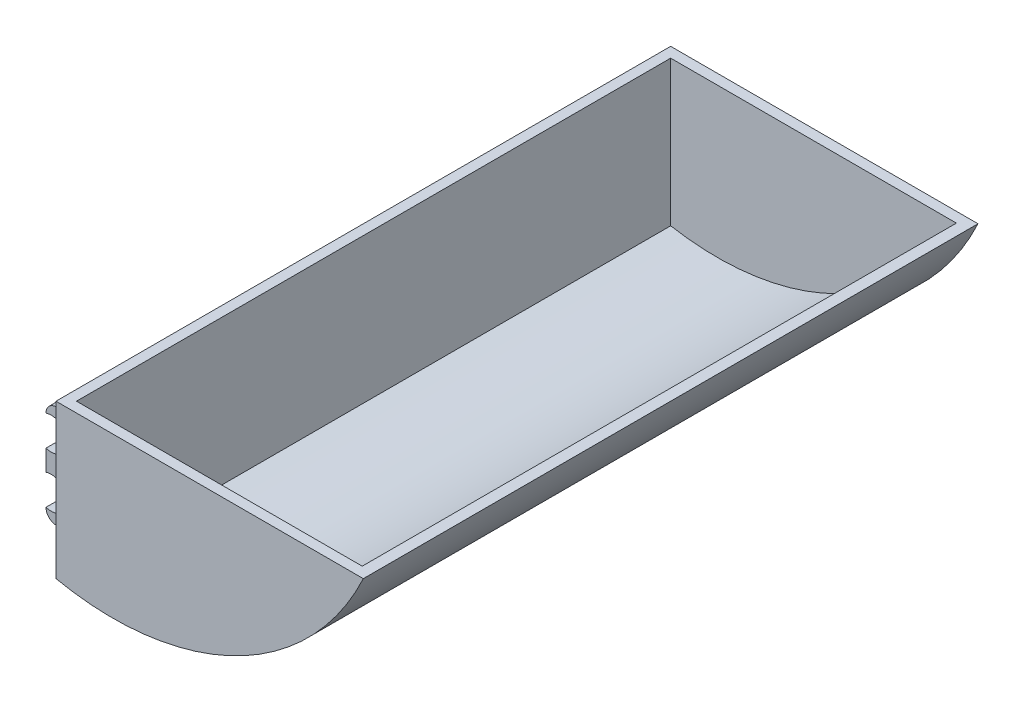
ISO-10303-21;
HEADER;
FILE_DESCRIPTION(('STEP AP214'),'2;1');
FILE_NAME('part.step','',(''),(''),'','','');
FILE_SCHEMA(('AUTOMOTIVE_DESIGN { 1 0 10303 214 1 1 1 1 }'));
ENDSEC;
DATA;
#1=APPLICATION_CONTEXT('core data for automotive mechanical design processes');
#2=APPLICATION_PROTOCOL_DEFINITION('international standard','automotive_design',2000,#1);
#3=PRODUCT_CONTEXT('',#1,'mechanical');
#4=PRODUCT('Part','Part','',(#3));
#5=PRODUCT_RELATED_PRODUCT_CATEGORY('part','',(#4));
#6=PRODUCT_DEFINITION_FORMATION('','',#4);
#7=PRODUCT_DEFINITION_CONTEXT('part definition',#1,'design');
#8=PRODUCT_DEFINITION('design','',#6,#7);
#9=PRODUCT_DEFINITION_SHAPE('','',#8);
#10=(LENGTH_UNIT() NAMED_UNIT(*) SI_UNIT(.MILLI.,.METRE.));
#11=(NAMED_UNIT(*) PLANE_ANGLE_UNIT() SI_UNIT($,.RADIAN.));
#12=(NAMED_UNIT(*) SI_UNIT($,.STERADIAN.) SOLID_ANGLE_UNIT());
#13=UNCERTAINTY_MEASURE_WITH_UNIT(LENGTH_MEASURE(1.E-05),#10,'distance_accuracy_value','');
#14=(GEOMETRIC_REPRESENTATION_CONTEXT(3) GLOBAL_UNCERTAINTY_ASSIGNED_CONTEXT((#13)) GLOBAL_UNIT_ASSIGNED_CONTEXT((#10,
#11,#12)) REPRESENTATION_CONTEXT('',''));
#15=CARTESIAN_POINT('',(0.,0.,0.));
#16=DIRECTION('',(0.,0.,1.));
#17=DIRECTION('',(1.,0.,0.));
#18=AXIS2_PLACEMENT_3D('',#15,#16,#17);
#19=CARTESIAN_POINT('',(-7.62,0.,152.4));
#20=DIRECTION('',(-1.,0.,0.));
#21=DIRECTION('',(0.,0.,-1.));
#22=AXIS2_PLACEMENT_3D('',#19,#20,#21);
#23=PLANE('',#22);
#24=DIRECTION('',(0.,1.,0.));
#25=VECTOR('',#24,1.);
#26=CARTESIAN_POINT('',(-7.62,31.75,147.2565));
#27=LINE('',#26,#25);
#28=CARTESIAN_POINT('',(-7.62,16.4533603290918,147.2565));
#29=VERTEX_POINT('',#28);
#30=CARTESIAN_POINT('',(-7.62,21.6466396709082,147.2565));
#31=VERTEX_POINT('',#30);
#32=EDGE_CURVE('E249',#29,#31,#27,.T.);
#33=ORIENTED_EDGE('',*,*,#32,.T.);
#34=DIRECTION('',(0.,0.,1.));
#35=VECTOR('',#34,1.);
#36=CARTESIAN_POINT('',(-7.62,21.6466396709082,134.5565));
#37=LINE('',#36,#35);
#38=CARTESIAN_POINT('',(-7.62,21.6466396709082,139.319));
#39=VERTEX_POINT('',#38);
#40=EDGE_CURVE('E481',#31,#39,#37,.F.);
#41=ORIENTED_EDGE('',*,*,#40,.T.);
#42=DIRECTION('',(0.,-1.,0.));
#43=VECTOR('',#42,1.);
#44=CARTESIAN_POINT('',(-7.62,31.75,139.319));
#45=LINE('',#44,#43);
#46=CARTESIAN_POINT('',(-7.62,16.4533603290918,139.319));
#47=VERTEX_POINT('',#46);
#48=EDGE_CURVE('E281',#39,#47,#45,.T.);
#49=ORIENTED_EDGE('',*,*,#48,.T.);
#50=DIRECTION('',(0.,0.,1.));
#51=VECTOR('',#50,1.);
#52=CARTESIAN_POINT('',(-7.62,16.4533603290918,134.5565));
#53=LINE('',#52,#51);
#54=EDGE_CURVE('E260',#47,#29,#53,.T.);
#55=ORIENTED_EDGE('',*,*,#54,.T.);
#56=EDGE_LOOP('',(#33,#41,#49,#55));
#57=FACE_BOUND('',#56,.T.);
#58=ADVANCED_FACE('F39',(#57),#23,.T.);
#59=CARTESIAN_POINT('',(-7.62,29.1533603290918,147.2565));
#60=VERTEX_POINT('',#59);
#61=CARTESIAN_POINT('',(-7.62,29.21,147.2565));
#62=VERTEX_POINT('',#61);
#63=EDGE_CURVE('E251',#60,#62,#27,.T.);
#64=ORIENTED_EDGE('',*,*,#63,.T.);
#65=DIRECTION('',(0.,0.,-1.));
#66=VECTOR('',#65,1.);
#67=CARTESIAN_POINT('',(-7.62,29.21,139.319));
#68=LINE('',#67,#66);
#69=CARTESIAN_POINT('',(-7.62,29.21,139.319));
#70=VERTEX_POINT('',#69);
#71=EDGE_CURVE('E512',#62,#70,#68,.T.);
#72=ORIENTED_EDGE('',*,*,#71,.T.);
#73=CARTESIAN_POINT('',(-7.62,29.1533603290918,139.319));
#74=VERTEX_POINT('',#73);
#75=EDGE_CURVE('E277',#70,#74,#45,.T.);
#76=ORIENTED_EDGE('',*,*,#75,.T.);
#77=DIRECTION('',(0.,0.,1.));
#78=VECTOR('',#77,1.);
#79=CARTESIAN_POINT('',(-7.62,29.1533603290918,134.5565));
#80=LINE('',#79,#78);
#81=EDGE_CURVE('E259',#74,#60,#80,.T.);
#82=ORIENTED_EDGE('',*,*,#81,.T.);
#83=EDGE_LOOP('',(#64,#72,#76,#82));
#84=FACE_BOUND('',#83,.T.);
#85=ADVANCED_FACE('F562',(#84),#23,.T.);
#86=CARTESIAN_POINT('',(-7.62,8.94663967090822,139.319));
#87=VERTEX_POINT('',#86);
#88=CARTESIAN_POINT('',(-7.62,8.89,139.319));
#89=VERTEX_POINT('',#88);
#90=EDGE_CURVE('E248',#87,#89,#45,.T.);
#91=ORIENTED_EDGE('',*,*,#90,.T.);
#92=DIRECTION('',(0.,0.,1.));
#93=VECTOR('',#92,1.);
#94=CARTESIAN_POINT('',(-7.62,8.89,147.2565));
#95=LINE('',#94,#93);
#96=CARTESIAN_POINT('',(-7.62,8.89,147.2565));
#97=VERTEX_POINT('',#96);
#98=EDGE_CURVE('E244',#89,#97,#95,.T.);
#99=ORIENTED_EDGE('',*,*,#98,.T.);
#100=CARTESIAN_POINT('',(-7.62,8.94663967090822,147.2565));
#101=VERTEX_POINT('',#100);
#102=EDGE_CURVE('E237',#97,#101,#27,.T.);
#103=ORIENTED_EDGE('',*,*,#102,.T.);
#104=DIRECTION('',(0.,0.,1.));
#105=VECTOR('',#104,1.);
#106=CARTESIAN_POINT('',(-7.62,8.94663967090822,134.5565));
#107=LINE('',#106,#105);
#108=EDGE_CURVE('E241',#101,#87,#107,.F.);
#109=ORIENTED_EDGE('',*,*,#108,.T.);
#110=EDGE_LOOP('',(#91,#99,#103,#109));
#111=FACE_BOUND('',#110,.T.);
#112=ADVANCED_FACE('F240',(#111),#23,.T.);
#113=CARTESIAN_POINT('',(0.,0.,152.4));
#114=DIRECTION('',(1.,0.,0.));
#115=DIRECTION('',(0.,0.,-1.));
#116=AXIS2_PLACEMENT_3D('',#113,#114,#115);
#117=PLANE('',#116);
#118=DIRECTION('',(0.,-1.,0.));
#119=VECTOR('',#118,1.);
#120=CARTESIAN_POINT('',(0.,0.,0.));
#121=LINE('',#120,#119);
#122=CARTESIAN_POINT('',(0.,38.1,0.));
#123=VERTEX_POINT('',#122);
#124=CARTESIAN_POINT('',(0.,0.,0.));
#125=VERTEX_POINT('',#124);
#126=EDGE_CURVE('E384',#123,#125,#121,.T.);
#127=ORIENTED_EDGE('',*,*,#126,.T.);
#128=DIRECTION('',(0.,0.,-1.));
#129=VECTOR('',#128,1.);
#130=CARTESIAN_POINT('',(0.,0.,152.4));
#131=LINE('',#130,#129);
#132=CARTESIAN_POINT('',(0.,0.,152.4));
#133=VERTEX_POINT('',#132);
#134=EDGE_CURVE('E390',#133,#125,#131,.T.);
#135=ORIENTED_EDGE('',*,*,#134,.F.);
#136=DIRECTION('',(0.,-1.,0.));
#137=VECTOR('',#136,1.);
#138=CARTESIAN_POINT('',(0.,0.,152.4));
#139=LINE('',#138,#137);
#140=CARTESIAN_POINT('',(0.,38.1,152.4));
#141=VERTEX_POINT('',#140);
#142=EDGE_CURVE('E387',#141,#133,#139,.T.);
#143=ORIENTED_EDGE('',*,*,#142,.F.);
#144=DIRECTION('',(0.,0.,-1.));
#145=VECTOR('',#144,1.);
#146=CARTESIAN_POINT('',(0.,38.1,152.4));
#147=LINE('',#146,#145);
#148=EDGE_CURVE('E402',#141,#123,#147,.T.);
#149=ORIENTED_EDGE('',*,*,#148,.T.);
#150=EDGE_LOOP('',(#127,#135,#143,#149));
#151=FACE_BOUND('',#150,.T.);
#152=DIRECTION('',(0.,0.,-1.));
#153=VECTOR('',#152,1.);
#154=CARTESIAN_POINT('',(0.,3.80999999999999,152.4));
#155=LINE('',#154,#153);
#156=CARTESIAN_POINT('',(0.,3.81,13.081));
#157=VERTEX_POINT('',#156);
#158=CARTESIAN_POINT('',(0.,3.81,5.14350000000001));
#159=VERTEX_POINT('',#158);
#160=EDGE_CURVE('E448',#157,#159,#155,.T.);
#161=ORIENTED_EDGE('',*,*,#160,.T.);
#162=DIRECTION('',(0.,1.,0.));
#163=VECTOR('',#162,1.);
#164=CARTESIAN_POINT('',(0.,31.75,5.14350000000001));
#165=LINE('',#164,#163);
#166=CARTESIAN_POINT('',(0.,34.29,5.14350000000001));
#167=VERTEX_POINT('',#166);
#168=EDGE_CURVE('E315',#159,#167,#165,.T.);
#169=ORIENTED_EDGE('',*,*,#168,.T.);
#170=DIRECTION('',(0.,0.,1.));
#171=VECTOR('',#170,1.);
#172=CARTESIAN_POINT('',(0.,34.2899999999999,152.4));
#173=LINE('',#172,#171);
#174=CARTESIAN_POINT('',(0.,34.29,13.081));
#175=VERTEX_POINT('',#174);
#176=EDGE_CURVE('E444',#167,#175,#173,.T.);
#177=ORIENTED_EDGE('',*,*,#176,.T.);
#178=DIRECTION('',(0.,-1.,0.));
#179=VECTOR('',#178,1.);
#180=CARTESIAN_POINT('',(0.,31.75,13.081));
#181=LINE('',#180,#179);
#182=EDGE_CURVE('E329',#175,#157,#181,.T.);
#183=ORIENTED_EDGE('',*,*,#182,.T.);
#184=EDGE_LOOP('',(#161,#169,#177,#183));
#185=FACE_BOUND('',#184,.T.);
#186=DIRECTION('',(0.,1.,0.));
#187=VECTOR('',#186,1.);
#188=CARTESIAN_POINT('',(0.,31.75,147.2565));
#189=LINE('',#188,#187);
#190=CARTESIAN_POINT('',(0.,3.81,147.2565));
#191=VERTEX_POINT('',#190);
#192=CARTESIAN_POINT('',(0.,34.29,147.2565));
#193=VERTEX_POINT('',#192);
#194=EDGE_CURVE('E55',#191,#193,#189,.T.);
#195=ORIENTED_EDGE('',*,*,#194,.F.);
#196=DIRECTION('',(0.,0.,1.));
#197=VECTOR('',#196,1.);
#198=CARTESIAN_POINT('',(0.,3.81,139.319));
#199=LINE('',#198,#197);
#200=CARTESIAN_POINT('',(0.,3.81,139.319));
#201=VERTEX_POINT('',#200);
#202=EDGE_CURVE('E509',#191,#201,#199,.F.);
#203=ORIENTED_EDGE('',*,*,#202,.T.);
#204=DIRECTION('',(0.,-1.,0.));
#205=VECTOR('',#204,1.);
#206=CARTESIAN_POINT('',(0.,31.75,139.319));
#207=LINE('',#206,#205);
#208=CARTESIAN_POINT('',(0.,34.29,139.319));
#209=VERTEX_POINT('',#208);
#210=EDGE_CURVE('E63',#209,#201,#207,.T.);
#211=ORIENTED_EDGE('',*,*,#210,.F.);
#212=DIRECTION('',(0.,0.,-1.));
#213=VECTOR('',#212,1.);
#214=CARTESIAN_POINT('',(0.,34.29,147.2565));
#215=LINE('',#214,#213);
#216=EDGE_CURVE('E506',#209,#193,#215,.F.);
#217=ORIENTED_EDGE('',*,*,#216,.T.);
#218=EDGE_LOOP('',(#195,#203,#211,#217));
#219=FACE_BOUND('',#218,.T.);
#220=ADVANCED_FACE('F536',(#151,#185,#219),#117,.F.);
#221=CARTESIAN_POINT('',(-7.62,0.,0.));
#222=DIRECTION('',(-1.,0.,0.));
#223=DIRECTION('',(0.,0.,1.));
#224=AXIS2_PLACEMENT_3D('',#221,#222,#223);
#225=PLANE('',#224);
#226=DIRECTION('',(0.,-1.,0.));
#227=VECTOR('',#226,1.);
#228=CARTESIAN_POINT('',(-7.62,31.75,13.081));
#229=LINE('',#228,#227);
#230=CARTESIAN_POINT('',(-7.62,29.21,13.081));
#231=VERTEX_POINT('',#230);
#232=CARTESIAN_POINT('',(-7.62,29.1533603290918,13.081));
#233=VERTEX_POINT('',#232);
#234=EDGE_CURVE('E322',#231,#233,#229,.T.);
#235=ORIENTED_EDGE('',*,*,#234,.F.);
#236=DIRECTION('',(0.,0.,1.));
#237=VECTOR('',#236,1.);
#238=CARTESIAN_POINT('',(-7.62,29.21,0.));
#239=LINE('',#238,#237);
#240=CARTESIAN_POINT('',(-7.62,29.21,5.14350000000001));
#241=VERTEX_POINT('',#240);
#242=EDGE_CURVE('E459',#231,#241,#239,.F.);
#243=ORIENTED_EDGE('',*,*,#242,.T.);
#244=DIRECTION('',(0.,1.,0.));
#245=VECTOR('',#244,1.);
#246=CARTESIAN_POINT('',(-7.62,31.75,5.14350000000001));
#247=LINE('',#246,#245);
#248=CARTESIAN_POINT('',(-7.62,29.1533603290918,5.14350000000001));
#249=VERTEX_POINT('',#248);
#250=EDGE_CURVE('E321',#249,#241,#247,.T.);
#251=ORIENTED_EDGE('',*,*,#250,.F.);
#252=DIRECTION('',(0.,0.,-1.));
#253=VECTOR('',#252,1.);
#254=CARTESIAN_POINT('',(-7.62,29.1533603290918,17.8435));
#255=LINE('',#254,#253);
#256=EDGE_CURVE('E419',#233,#249,#255,.T.);
#257=ORIENTED_EDGE('',*,*,#256,.F.);
#258=EDGE_LOOP('',(#235,#243,#251,#257));
#259=FACE_BOUND('',#258,.T.);
#260=ADVANCED_FACE('F592',(#259),#225,.T.);
#261=DIRECTION('',(0.,0.,-1.));
#262=VECTOR('',#261,1.);
#263=CARTESIAN_POINT('',(-7.62,21.6466396709082,17.8435));
#264=LINE('',#263,#262);
#265=CARTESIAN_POINT('',(-7.62,21.6466396709082,5.14350000000001));
#266=VERTEX_POINT('',#265);
#267=CARTESIAN_POINT('',(-7.62,21.6466396709082,13.081));
#268=VERTEX_POINT('',#267);
#269=EDGE_CURVE('E416',#266,#268,#264,.F.);
#270=ORIENTED_EDGE('',*,*,#269,.F.);
#271=CARTESIAN_POINT('',(-7.62,16.4533603290918,5.14350000000001));
#272=VERTEX_POINT('',#271);
#273=EDGE_CURVE('E320',#272,#266,#247,.T.);
#274=ORIENTED_EDGE('',*,*,#273,.F.);
#275=DIRECTION('',(0.,0.,-1.));
#276=VECTOR('',#275,1.);
#277=CARTESIAN_POINT('',(-7.62,16.4533603290918,17.8435));
#278=LINE('',#277,#276);
#279=CARTESIAN_POINT('',(-7.62,16.4533603290918,13.081));
#280=VERTEX_POINT('',#279);
#281=EDGE_CURVE('E413',#280,#272,#278,.T.);
#282=ORIENTED_EDGE('',*,*,#281,.F.);
#283=EDGE_CURVE('E326',#268,#280,#229,.T.);
#284=ORIENTED_EDGE('',*,*,#283,.F.);
#285=EDGE_LOOP('',(#270,#274,#282,#284));
#286=FACE_BOUND('',#285,.T.);
#287=ADVANCED_FACE('F598',(#286),#225,.T.);
#288=CARTESIAN_POINT('',(0.,38.1,152.4));
#289=DIRECTION('',(0.,-1.,0.));
#290=DIRECTION('',(0.,0.,-1.));
#291=AXIS2_PLACEMENT_3D('',#288,#289,#290);
#292=PLANE('',#291);
#293=DIRECTION('',(-1.,0.,0.));
#294=VECTOR('',#293,1.);
#295=CARTESIAN_POINT('',(0.,38.1,0.));
#296=LINE('',#295,#294);
#297=CARTESIAN_POINT('',(76.2,38.1,0.));
#298=VERTEX_POINT('',#297);
#299=EDGE_CURVE('E394',#298,#123,#296,.T.);
#300=ORIENTED_EDGE('',*,*,#299,.T.);
#301=ORIENTED_EDGE('',*,*,#148,.F.);
#302=DIRECTION('',(-1.,0.,0.));
#303=VECTOR('',#302,1.);
#304=CARTESIAN_POINT('',(0.,38.1,152.4));
#305=LINE('',#304,#303);
#306=CARTESIAN_POINT('',(76.2,38.1,152.4));
#307=VERTEX_POINT('',#306);
#308=EDGE_CURVE('E383',#307,#141,#305,.T.);
#309=ORIENTED_EDGE('',*,*,#308,.F.);
#310=DIRECTION('',(0.,0.,-1.));
#311=VECTOR('',#310,1.);
#312=CARTESIAN_POINT('',(76.2,38.1,152.4));
#313=LINE('',#312,#311);
#314=EDGE_CURVE('E406',#307,#298,#313,.T.);
#315=ORIENTED_EDGE('',*,*,#314,.T.);
#316=EDGE_LOOP('',(#300,#301,#309,#315));
#317=FACE_BOUND('',#316,.T.);
#318=DIRECTION('',(-1.,0.,0.));
#319=VECTOR('',#318,1.);
#320=CARTESIAN_POINT('',(14.0637611095246,38.1,2.54));
#321=LINE('',#320,#319);
#322=CARTESIAN_POINT('',(73.3847302810935,38.1,2.54));
#323=VERTEX_POINT('',#322);
#324=CARTESIAN_POINT('',(2.54,38.1,2.54));
#325=VERTEX_POINT('',#324);
#326=EDGE_CURVE('E351',#323,#325,#321,.T.);
#327=ORIENTED_EDGE('',*,*,#326,.F.);
#328=DIRECTION('',(0.,0.,-1.));
#329=VECTOR('',#328,1.);
#330=CARTESIAN_POINT('',(73.3847302810935,38.1,149.86));
#331=LINE('',#330,#329);
#332=CARTESIAN_POINT('',(73.3847302810935,38.1,149.86));
#333=VERTEX_POINT('',#332);
#334=EDGE_CURVE('E367',#333,#323,#331,.T.);
#335=ORIENTED_EDGE('',*,*,#334,.F.);
#336=DIRECTION('',(-1.,0.,0.));
#337=VECTOR('',#336,1.);
#338=CARTESIAN_POINT('',(14.0637611095246,38.1,149.86));
#339=LINE('',#338,#337);
#340=CARTESIAN_POINT('',(2.54,38.1,149.86));
#341=VERTEX_POINT('',#340);
#342=EDGE_CURVE('E355',#333,#341,#339,.T.);
#343=ORIENTED_EDGE('',*,*,#342,.T.);
#344=DIRECTION('',(0.,0.,-1.));
#345=VECTOR('',#344,1.);
#346=CARTESIAN_POINT('',(2.54,38.1,152.4));
#347=LINE('',#346,#345);
#348=EDGE_CURVE('E361',#341,#325,#347,.T.);
#349=ORIENTED_EDGE('',*,*,#348,.T.);
#350=EDGE_LOOP('',(#327,#335,#343,#349));
#351=FACE_BOUND('',#350,.T.);
#352=ADVANCED_FACE('F607',(#317,#351),#292,.F.);
#353=CARTESIAN_POINT('',(14.0637611095246,67.1224777809507,152.4));
#354=DIRECTION('',(0.,0.,-1.));
#355=DIRECTION('',(-1.,0.,0.));
#356=AXIS2_PLACEMENT_3D('',#353,#354,#355);
#357=CYLINDRICAL_SURFACE('',#356,68.58);
#358=CARTESIAN_POINT('',(14.0637611095246,67.1224777809507,0.));
#359=DIRECTION('',(0.,0.,1.));
#360=DIRECTION('',(-1.,0.,0.));
#361=AXIS2_PLACEMENT_3D('',#358,#359,#360);
#362=CIRCLE('',#361,68.58);
#363=EDGE_CURVE('E370',#125,#298,#362,.T.);
#364=ORIENTED_EDGE('',*,*,#363,.T.);
#365=ORIENTED_EDGE('',*,*,#314,.F.);
#366=CARTESIAN_POINT('',(14.0637611095246,67.1224777809507,152.4));
#367=DIRECTION('',(0.,0.,1.));
#368=DIRECTION('',(-1.,0.,0.));
#369=AXIS2_PLACEMENT_3D('',#366,#367,#368);
#370=CIRCLE('',#369,68.58);
#371=EDGE_CURVE('E379',#133,#307,#370,.T.);
#372=ORIENTED_EDGE('',*,*,#371,.F.);
#373=ORIENTED_EDGE('',*,*,#134,.T.);
#374=EDGE_LOOP('',(#364,#365,#372,#373));
#375=FACE_BOUND('',#374,.T.);
#376=ADVANCED_FACE('F610',(#375),#357,.T.);
#377=CARTESIAN_POINT('',(14.0637611095246,67.1224777809507,152.4));
#378=DIRECTION('',(0.,0.,-1.));
#379=DIRECTION('',(-1.,0.,0.));
#380=AXIS2_PLACEMENT_3D('',#377,#378,#379);
#381=PLANE('',#380);
#382=ORIENTED_EDGE('',*,*,#371,.T.);
#383=ORIENTED_EDGE('',*,*,#308,.T.);
#384=ORIENTED_EDGE('',*,*,#142,.T.);
#385=EDGE_LOOP('',(#382,#383,#384));
#386=FACE_BOUND('',#385,.T.);
#387=ADVANCED_FACE('F614',(#386),#381,.F.);
#388=CARTESIAN_POINT('',(14.0637611095246,67.1224777809507,0.));
#389=DIRECTION('',(0.,0.,-1.));
#390=DIRECTION('',(-1.,0.,0.));
#391=AXIS2_PLACEMENT_3D('',#388,#389,#390);
#392=PLANE('',#391);
#393=ORIENTED_EDGE('',*,*,#363,.F.);
#394=ORIENTED_EDGE('',*,*,#126,.F.);
#395=ORIENTED_EDGE('',*,*,#299,.F.);
#396=EDGE_LOOP('',(#393,#394,#395));
#397=FACE_BOUND('',#396,.T.);
#398=ADVANCED_FACE('F605',(#397),#392,.T.);
#399=CARTESIAN_POINT('',(14.0637611095246,67.1224777809507,152.4));
#400=DIRECTION('',(0.,0.,-1.));
#401=DIRECTION('',(-1.,0.,0.));
#402=AXIS2_PLACEMENT_3D('',#399,#400,#401);
#403=CYLINDRICAL_SURFACE('',#402,66.04);
#404=CARTESIAN_POINT('',(14.0637611095246,67.1224777809507,2.53999999999999));
#405=DIRECTION('',(0.,0.,-1.));
#406=DIRECTION('',(-1.,0.,0.));
#407=AXIS2_PLACEMENT_3D('',#404,#405,#406);
#408=CIRCLE('',#407,66.04);
#409=CARTESIAN_POINT('',(2.54,2.09567922919507,2.54));
#410=VERTEX_POINT('',#409);
#411=EDGE_CURVE('E336',#410,#323,#408,.F.);
#412=ORIENTED_EDGE('',*,*,#411,.F.);
#413=DIRECTION('',(0.,0.,-1.));
#414=VECTOR('',#413,1.);
#415=CARTESIAN_POINT('',(2.54,2.09567922919508,149.86));
#416=LINE('',#415,#414);
#417=CARTESIAN_POINT('',(2.54,2.09567922919508,149.86));
#418=VERTEX_POINT('',#417);
#419=EDGE_CURVE('E357',#418,#410,#416,.T.);
#420=ORIENTED_EDGE('',*,*,#419,.F.);
#421=CARTESIAN_POINT('',(14.0637611095246,67.1224777809507,149.86));
#422=DIRECTION('',(0.,0.,-1.));
#423=DIRECTION('',(-1.,0.,0.));
#424=AXIS2_PLACEMENT_3D('',#421,#422,#423);
#425=CIRCLE('',#424,66.04);
#426=EDGE_CURVE('E352',#418,#333,#425,.F.);
#427=ORIENTED_EDGE('',*,*,#426,.T.);
#428=ORIENTED_EDGE('',*,*,#334,.T.);
#429=EDGE_LOOP('',(#412,#420,#427,#428));
#430=FACE_BOUND('',#429,.T.);
#431=ADVANCED_FACE('F849',(#430),#403,.F.);
#432=CARTESIAN_POINT('',(2.54,0.,152.4));
#433=DIRECTION('',(1.,0.,0.));
#434=DIRECTION('',(0.,0.,-1.));
#435=AXIS2_PLACEMENT_3D('',#432,#433,#434);
#436=PLANE('',#435);
#437=DIRECTION('',(0.,-1.,0.));
#438=VECTOR('',#437,1.);
#439=CARTESIAN_POINT('',(2.54,67.1224777809507,2.54));
#440=LINE('',#439,#438);
#441=EDGE_CURVE('E356',#325,#410,#440,.T.);
#442=ORIENTED_EDGE('',*,*,#441,.F.);
#443=ORIENTED_EDGE('',*,*,#348,.F.);
#444=DIRECTION('',(0.,-1.,0.));
#445=VECTOR('',#444,1.);
#446=CARTESIAN_POINT('',(2.54,67.1224777809507,149.86));
#447=LINE('',#446,#445);
#448=EDGE_CURVE('E362',#341,#418,#447,.T.);
#449=ORIENTED_EDGE('',*,*,#448,.T.);
#450=ORIENTED_EDGE('',*,*,#419,.T.);
#451=EDGE_LOOP('',(#442,#443,#449,#450));
#452=FACE_BOUND('',#451,.T.);
#453=ADVANCED_FACE('F839',(#452),#436,.T.);
#454=CARTESIAN_POINT('',(14.0637611095246,67.1224777809507,149.86));
#455=DIRECTION('',(0.,0.,-1.));
#456=DIRECTION('',(-1.,0.,0.));
#457=AXIS2_PLACEMENT_3D('',#454,#455,#456);
#458=PLANE('',#457);
#459=ORIENTED_EDGE('',*,*,#426,.F.);
#460=ORIENTED_EDGE('',*,*,#448,.F.);
#461=ORIENTED_EDGE('',*,*,#342,.F.);
#462=EDGE_LOOP('',(#459,#460,#461));
#463=FACE_BOUND('',#462,.T.);
#464=ADVANCED_FACE('F829',(#463),#458,.T.);
#465=CARTESIAN_POINT('',(14.0637611095246,67.1224777809507,2.54));
#466=DIRECTION('',(0.,0.,-1.));
#467=DIRECTION('',(-1.,0.,0.));
#468=AXIS2_PLACEMENT_3D('',#465,#466,#467);
#469=PLANE('',#468);
#470=ORIENTED_EDGE('',*,*,#411,.T.);
#471=ORIENTED_EDGE('',*,*,#326,.T.);
#472=ORIENTED_EDGE('',*,*,#441,.T.);
#473=EDGE_LOOP('',(#470,#471,#472));
#474=FACE_BOUND('',#473,.T.);
#475=ADVANCED_FACE('F791',(#474),#469,.F.);
#476=CARTESIAN_POINT('',(-7.62,31.75,5.14350000000001));
#477=DIRECTION('',(0.,0.,-1.));
#478=DIRECTION('',(0.,1.,0.));
#479=AXIS2_PLACEMENT_3D('',#476,#477,#478);
#480=PLANE('',#479);
#481=DIRECTION('',(1.,0.,0.));
#482=VECTOR('',#481,1.);
#483=CARTESIAN_POINT('',(-7.62,6.35,5.14350000000001));
#484=LINE('',#483,#482);
#485=CARTESIAN_POINT('',(-5.08,6.35,5.14350000000001));
#486=VERTEX_POINT('',#485);
#487=CARTESIAN_POINT('',(-2.54,6.35,5.14350000000001));
#488=VERTEX_POINT('',#487);
#489=EDGE_CURVE('E332',#486,#488,#484,.T.);
#490=ORIENTED_EDGE('',*,*,#489,.F.);
#491=CARTESIAN_POINT('',(-5.08,8.89,5.14350000000001));
#492=DIRECTION('',(0.,0.,-1.));
#493=DIRECTION('',(0.,1.,0.));
#494=AXIS2_PLACEMENT_3D('',#491,#492,#493);
#495=CIRCLE('',#494,2.54);
#496=CARTESIAN_POINT('',(-7.62,8.89,5.14350000000001));
#497=VERTEX_POINT('',#496);
#498=EDGE_CURVE('E432',#486,#497,#495,.T.);
#499=ORIENTED_EDGE('',*,*,#498,.T.);
#500=CARTESIAN_POINT('',(-7.62,8.94663967090822,5.14350000000001));
#501=VERTEX_POINT('',#500);
#502=EDGE_CURVE('E316',#497,#501,#247,.T.);
#503=ORIENTED_EDGE('',*,*,#502,.T.);
#504=CARTESIAN_POINT('',(-6.35,12.7,5.14350000000001));
#505=DIRECTION('',(0.,0.,-1.));
#506=DIRECTION('',(0.,1.,0.));
#507=AXIS2_PLACEMENT_3D('',#504,#505,#506);
#508=CIRCLE('',#507,3.9624);
#509=EDGE_CURVE('E290',#272,#501,#508,.T.);
#510=ORIENTED_EDGE('',*,*,#509,.F.);
#511=ORIENTED_EDGE('',*,*,#273,.T.);
#512=CARTESIAN_POINT('',(-6.35,25.4,5.14350000000001));
#513=DIRECTION('',(0.,0.,-1.));
#514=DIRECTION('',(0.,1.,0.));
#515=AXIS2_PLACEMENT_3D('',#512,#513,#514);
#516=CIRCLE('',#515,3.9624);
#517=EDGE_CURVE('E302',#249,#266,#516,.T.);
#518=ORIENTED_EDGE('',*,*,#517,.F.);
#519=ORIENTED_EDGE('',*,*,#250,.T.);
#520=CARTESIAN_POINT('',(-5.08,29.21,5.14350000000001));
#521=DIRECTION('',(0.,0.,-1.));
#522=DIRECTION('',(0.,1.,0.));
#523=AXIS2_PLACEMENT_3D('',#520,#521,#522);
#524=CIRCLE('',#523,2.54);
#525=CARTESIAN_POINT('',(-5.08,31.75,5.14350000000001));
#526=VERTEX_POINT('',#525);
#527=EDGE_CURVE('E429',#241,#526,#524,.T.);
#528=ORIENTED_EDGE('',*,*,#527,.T.);
#529=DIRECTION('',(1.,0.,0.));
#530=VECTOR('',#529,1.);
#531=CARTESIAN_POINT('',(-7.62,31.75,5.14350000000001));
#532=LINE('',#531,#530);
#533=CARTESIAN_POINT('',(-2.54,31.75,5.14350000000001));
#534=VERTEX_POINT('',#533);
#535=EDGE_CURVE('E325',#526,#534,#532,.T.);
#536=ORIENTED_EDGE('',*,*,#535,.T.);
#537=CARTESIAN_POINT('',(-2.54,34.29,5.14350000000002));
#538=DIRECTION('',(0.,0.,-1.));
#539=DIRECTION('',(0.,1.,0.));
#540=AXIS2_PLACEMENT_3D('',#537,#538,#539);
#541=CIRCLE('',#540,2.54);
#542=EDGE_CURVE('E472',#534,#167,#541,.F.);
#543=ORIENTED_EDGE('',*,*,#542,.T.);
#544=ORIENTED_EDGE('',*,*,#168,.F.);
#545=CARTESIAN_POINT('',(-2.54,3.81,5.1435));
#546=DIRECTION('',(0.,0.,-1.));
#547=DIRECTION('',(0.,1.,0.));
#548=AXIS2_PLACEMENT_3D('',#545,#546,#547);
#549=CIRCLE('',#548,2.54);
#550=EDGE_CURVE('E462',#159,#488,#549,.F.);
#551=ORIENTED_EDGE('',*,*,#550,.T.);
#552=EDGE_LOOP('',(#490,#499,#503,#510,#511,#518,#519,#528,#536,#543,#544,#551));
#553=FACE_BOUND('',#552,.T.);
#554=ADVANCED_FACE('F781',(#553),#480,.T.);
#555=CARTESIAN_POINT('',(-7.62,6.35,5.14350000000001));
#556=DIRECTION('',(0.,-1.,0.));
#557=DIRECTION('',(0.,0.,-1.));
#558=AXIS2_PLACEMENT_3D('',#555,#556,#557);
#559=PLANE('',#558);
#560=DIRECTION('',(1.,0.,0.));
#561=VECTOR('',#560,1.);
#562=CARTESIAN_POINT('',(-7.62,6.35,13.081));
#563=LINE('',#562,#561);
#564=CARTESIAN_POINT('',(-5.08,6.35,13.081));
#565=VERTEX_POINT('',#564);
#566=CARTESIAN_POINT('',(-2.54,6.35,13.081));
#567=VERTEX_POINT('',#566);
#568=EDGE_CURVE('E337',#565,#567,#563,.T.);
#569=ORIENTED_EDGE('',*,*,#568,.F.);
#570=DIRECTION('',(0.,0.,-1.));
#571=VECTOR('',#570,1.);
#572=CARTESIAN_POINT('',(-5.08,6.35,5.14350000000001));
#573=LINE('',#572,#571);
#574=EDGE_CURVE('E425',#565,#486,#573,.T.);
#575=ORIENTED_EDGE('',*,*,#574,.T.);
#576=ORIENTED_EDGE('',*,*,#489,.T.);
#577=DIRECTION('',(0.,0.,-1.));
#578=VECTOR('',#577,1.);
#579=CARTESIAN_POINT('',(-2.54,6.35,5.14350000000001));
#580=LINE('',#579,#578);
#581=EDGE_CURVE('E422',#488,#567,#580,.F.);
#582=ORIENTED_EDGE('',*,*,#581,.T.);
#583=EDGE_LOOP('',(#569,#575,#576,#582));
#584=FACE_BOUND('',#583,.T.);
#585=ADVANCED_FACE('F771',(#584),#559,.T.);
#586=CARTESIAN_POINT('',(-7.62,31.75,13.081));
#587=DIRECTION('',(0.,0.,1.));
#588=DIRECTION('',(0.,-1.,0.));
#589=AXIS2_PLACEMENT_3D('',#586,#587,#588);
#590=PLANE('',#589);
#591=CARTESIAN_POINT('',(-7.62,8.94663967090822,13.081));
#592=VERTEX_POINT('',#591);
#593=CARTESIAN_POINT('',(-7.62,8.89,13.081));
#594=VERTEX_POINT('',#593);
#595=EDGE_CURVE('E319',#592,#594,#229,.T.);
#596=ORIENTED_EDGE('',*,*,#595,.T.);
#597=CARTESIAN_POINT('',(-5.08,8.89,13.081));
#598=DIRECTION('',(0.,0.,1.));
#599=DIRECTION('',(0.,-1.,0.));
#600=AXIS2_PLACEMENT_3D('',#597,#598,#599);
#601=CIRCLE('',#600,2.54);
#602=EDGE_CURVE('E441',#594,#565,#601,.T.);
#603=ORIENTED_EDGE('',*,*,#602,.T.);
#604=ORIENTED_EDGE('',*,*,#568,.T.);
#605=CARTESIAN_POINT('',(-2.54,3.81,13.081));
#606=DIRECTION('',(0.,0.,1.));
#607=DIRECTION('',(0.,-1.,0.));
#608=AXIS2_PLACEMENT_3D('',#605,#606,#607);
#609=CIRCLE('',#608,2.54);
#610=EDGE_CURVE('E465',#567,#157,#609,.F.);
#611=ORIENTED_EDGE('',*,*,#610,.T.);
#612=ORIENTED_EDGE('',*,*,#182,.F.);
#613=CARTESIAN_POINT('',(-2.54,34.29,13.081));
#614=DIRECTION('',(0.,0.,1.));
#615=DIRECTION('',(0.,-1.,0.));
#616=AXIS2_PLACEMENT_3D('',#613,#614,#615);
#617=CIRCLE('',#616,2.54);
#618=CARTESIAN_POINT('',(-2.54,31.75,13.081));
#619=VERTEX_POINT('',#618);
#620=EDGE_CURVE('E469',#175,#619,#617,.F.);
#621=ORIENTED_EDGE('',*,*,#620,.T.);
#622=DIRECTION('',(1.,0.,0.));
#623=VECTOR('',#622,1.);
#624=CARTESIAN_POINT('',(-7.62,31.75,13.081));
#625=LINE('',#624,#623);
#626=CARTESIAN_POINT('',(-5.08,31.75,13.081));
#627=VERTEX_POINT('',#626);
#628=EDGE_CURVE('E341',#627,#619,#625,.T.);
#629=ORIENTED_EDGE('',*,*,#628,.F.);
#630=CARTESIAN_POINT('',(-5.08,29.21,13.081));
#631=DIRECTION('',(0.,0.,1.));
#632=DIRECTION('',(0.,-1.,0.));
#633=AXIS2_PLACEMENT_3D('',#630,#631,#632);
#634=CIRCLE('',#633,2.54);
#635=EDGE_CURVE('E438',#627,#231,#634,.T.);
#636=ORIENTED_EDGE('',*,*,#635,.T.);
#637=ORIENTED_EDGE('',*,*,#234,.T.);
#638=CARTESIAN_POINT('',(-6.35,25.4,13.081));
#639=DIRECTION('',(0.,0.,1.));
#640=DIRECTION('',(0.,-1.,0.));
#641=AXIS2_PLACEMENT_3D('',#638,#639,#640);
#642=CIRCLE('',#641,3.9624);
#643=EDGE_CURVE('E311',#268,#233,#642,.T.);
#644=ORIENTED_EDGE('',*,*,#643,.F.);
#645=ORIENTED_EDGE('',*,*,#283,.T.);
#646=CARTESIAN_POINT('',(-6.35,12.7,13.081));
#647=DIRECTION('',(0.,0.,1.));
#648=DIRECTION('',(0.,-1.,0.));
#649=AXIS2_PLACEMENT_3D('',#646,#647,#648);
#650=CIRCLE('',#649,3.9624);
#651=EDGE_CURVE('E305',#592,#280,#650,.T.);
#652=ORIENTED_EDGE('',*,*,#651,.F.);
#653=EDGE_LOOP('',(#596,#603,#604,#611,#612,#621,#629,#636,#637,#644,#645,#652));
#654=FACE_BOUND('',#653,.T.);
#655=ADVANCED_FACE('F761',(#654),#590,.T.);
#656=CARTESIAN_POINT('',(-7.62,31.75,5.14350000000001));
#657=DIRECTION('',(0.,1.,0.));
#658=DIRECTION('',(0.,0.,1.));
#659=AXIS2_PLACEMENT_3D('',#656,#657,#658);
#660=PLANE('',#659);
#661=ORIENTED_EDGE('',*,*,#535,.F.);
#662=DIRECTION('',(0.,0.,1.));
#663=VECTOR('',#662,1.);
#664=CARTESIAN_POINT('',(-5.08,31.75,5.14350000000001));
#665=LINE('',#664,#663);
#666=EDGE_CURVE('E455',#526,#627,#665,.T.);
#667=ORIENTED_EDGE('',*,*,#666,.T.);
#668=ORIENTED_EDGE('',*,*,#628,.T.);
#669=DIRECTION('',(0.,0.,1.));
#670=VECTOR('',#669,1.);
#671=CARTESIAN_POINT('',(-2.54,31.75,5.14350000000001));
#672=LINE('',#671,#670);
#673=EDGE_CURVE('E452',#619,#534,#672,.F.);
#674=ORIENTED_EDGE('',*,*,#673,.T.);
#675=EDGE_LOOP('',(#661,#667,#668,#674));
#676=FACE_BOUND('',#675,.T.);
#677=ADVANCED_FACE('F750',(#676),#660,.T.);
#678=ORIENTED_EDGE('',*,*,#502,.F.);
#679=DIRECTION('',(0.,0.,-1.));
#680=VECTOR('',#679,1.);
#681=CARTESIAN_POINT('',(-7.62,8.89,0.));
#682=LINE('',#681,#680);
#683=EDGE_CURVE('E435',#497,#594,#682,.F.);
#684=ORIENTED_EDGE('',*,*,#683,.T.);
#685=ORIENTED_EDGE('',*,*,#595,.F.);
#686=DIRECTION('',(0.,0.,-1.));
#687=VECTOR('',#686,1.);
#688=CARTESIAN_POINT('',(-7.62,8.94663967090822,17.8435));
#689=LINE('',#688,#687);
#690=EDGE_CURVE('E410',#501,#592,#689,.F.);
#691=ORIENTED_EDGE('',*,*,#690,.F.);
#692=EDGE_LOOP('',(#678,#684,#685,#691));
#693=FACE_BOUND('',#692,.T.);
#694=ADVANCED_FACE('F601',(#693),#225,.T.);
#695=CARTESIAN_POINT('',(-6.35,12.7,17.8435));
#696=DIRECTION('',(0.,0.,-1.));
#697=DIRECTION('',(0.,1.,0.));
#698=AXIS2_PLACEMENT_3D('',#695,#696,#697);
#699=CYLINDRICAL_SURFACE('',#698,3.9624);
#700=ORIENTED_EDGE('',*,*,#281,.T.);
#701=ORIENTED_EDGE('',*,*,#509,.T.);
#702=ORIENTED_EDGE('',*,*,#690,.T.);
#703=ORIENTED_EDGE('',*,*,#651,.T.);
#704=EDGE_LOOP('',(#700,#701,#702,#703));
#705=FACE_BOUND('',#704,.T.);
#706=ADVANCED_FACE('F749',(#705),#699,.F.);
#707=CARTESIAN_POINT('',(-6.35,25.4,17.8435));
#708=DIRECTION('',(0.,0.,-1.));
#709=DIRECTION('',(0.,1.,0.));
#710=AXIS2_PLACEMENT_3D('',#707,#708,#709);
#711=CYLINDRICAL_SURFACE('',#710,3.9624);
#712=ORIENTED_EDGE('',*,*,#256,.T.);
#713=ORIENTED_EDGE('',*,*,#517,.T.);
#714=ORIENTED_EDGE('',*,*,#269,.T.);
#715=ORIENTED_EDGE('',*,*,#643,.T.);
#716=EDGE_LOOP('',(#712,#713,#714,#715));
#717=FACE_BOUND('',#716,.T.);
#718=ADVANCED_FACE('F620',(#717),#711,.F.);
#719=CARTESIAN_POINT('',(-5.08,8.89,5.14350000000001));
#720=DIRECTION('',(0.,0.,-1.));
#721=DIRECTION('',(0.,1.,0.));
#722=AXIS2_PLACEMENT_3D('',#719,#720,#721);
#723=CYLINDRICAL_SURFACE('',#722,2.54);
#724=ORIENTED_EDGE('',*,*,#602,.F.);
#725=ORIENTED_EDGE('',*,*,#683,.F.);
#726=ORIENTED_EDGE('',*,*,#498,.F.);
#727=ORIENTED_EDGE('',*,*,#574,.F.);
#728=EDGE_LOOP('',(#724,#725,#726,#727));
#729=FACE_BOUND('',#728,.T.);
#730=ADVANCED_FACE('F616',(#729),#723,.T.);
#731=CARTESIAN_POINT('',(-2.54,3.80999999999999,152.4));
#732=DIRECTION('',(0.,0.,-1.));
#733=DIRECTION('',(0.,1.,0.));
#734=AXIS2_PLACEMENT_3D('',#731,#732,#733);
#735=CYLINDRICAL_SURFACE('',#734,2.54);
#736=ORIENTED_EDGE('',*,*,#610,.F.);
#737=ORIENTED_EDGE('',*,*,#581,.F.);
#738=ORIENTED_EDGE('',*,*,#550,.F.);
#739=ORIENTED_EDGE('',*,*,#160,.F.);
#740=EDGE_LOOP('',(#736,#737,#738,#739));
#741=FACE_BOUND('',#740,.T.);
#742=ADVANCED_FACE('F619',(#741),#735,.F.);
#743=CARTESIAN_POINT('',(-5.08,29.21,5.14350000000001));
#744=DIRECTION('',(0.,0.,1.));
#745=DIRECTION('',(0.,-1.,0.));
#746=AXIS2_PLACEMENT_3D('',#743,#744,#745);
#747=CYLINDRICAL_SURFACE('',#746,2.54);
#748=ORIENTED_EDGE('',*,*,#527,.F.);
#749=ORIENTED_EDGE('',*,*,#242,.F.);
#750=ORIENTED_EDGE('',*,*,#635,.F.);
#751=ORIENTED_EDGE('',*,*,#666,.F.);
#752=EDGE_LOOP('',(#748,#749,#750,#751));
#753=FACE_BOUND('',#752,.T.);
#754=ADVANCED_FACE('F624',(#753),#747,.T.);
#755=CARTESIAN_POINT('',(-2.54,34.2899999999999,152.4));
#756=DIRECTION('',(0.,0.,1.));
#757=DIRECTION('',(0.,-1.,0.));
#758=AXIS2_PLACEMENT_3D('',#755,#756,#757);
#759=CYLINDRICAL_SURFACE('',#758,2.54);
#760=ORIENTED_EDGE('',*,*,#542,.F.);
#761=ORIENTED_EDGE('',*,*,#673,.F.);
#762=ORIENTED_EDGE('',*,*,#620,.F.);
#763=ORIENTED_EDGE('',*,*,#176,.F.);
#764=EDGE_LOOP('',(#760,#761,#762,#763));
#765=FACE_BOUND('',#764,.T.);
#766=ADVANCED_FACE('F580',(#765),#759,.F.);
#767=CARTESIAN_POINT('',(-7.62,31.75,147.2565));
#768=DIRECTION('',(0.,0.,-1.));
#769=DIRECTION('',(0.,1.,0.));
#770=AXIS2_PLACEMENT_3D('',#767,#768,#769);
#771=PLANE('',#770);
#772=ORIENTED_EDGE('',*,*,#102,.F.);
#773=CARTESIAN_POINT('',(-5.08,8.89,147.2565));
#774=DIRECTION('',(0.,0.,-1.));
#775=DIRECTION('',(0.,1.,0.));
#776=AXIS2_PLACEMENT_3D('',#773,#774,#775);
#777=CIRCLE('',#776,2.54);
#778=CARTESIAN_POINT('',(-5.08,6.35,147.2565));
#779=VERTEX_POINT('',#778);
#780=EDGE_CURVE('E490',#97,#779,#777,.F.);
#781=ORIENTED_EDGE('',*,*,#780,.T.);
#782=DIRECTION('',(1.,0.,0.));
#783=VECTOR('',#782,1.);
#784=CARTESIAN_POINT('',(-7.62,6.35,147.2565));
#785=LINE('',#784,#783);
#786=CARTESIAN_POINT('',(-2.54,6.35,147.2565));
#787=VERTEX_POINT('',#786);
#788=EDGE_CURVE('E280',#779,#787,#785,.T.);
#789=ORIENTED_EDGE('',*,*,#788,.T.);
#790=CARTESIAN_POINT('',(-2.54,3.81,147.2565));
#791=DIRECTION('',(0.,0.,-1.));
#792=DIRECTION('',(0.,1.,0.));
#793=AXIS2_PLACEMENT_3D('',#790,#791,#792);
#794=CIRCLE('',#793,2.54);
#795=EDGE_CURVE('E523',#787,#191,#794,.T.);
#796=ORIENTED_EDGE('',*,*,#795,.T.);
#797=ORIENTED_EDGE('',*,*,#194,.T.);
#798=CARTESIAN_POINT('',(-2.54,34.29,147.2565));
#799=DIRECTION('',(0.,0.,-1.));
#800=DIRECTION('',(0.,1.,0.));
#801=AXIS2_PLACEMENT_3D('',#798,#799,#800);
#802=CIRCLE('',#801,2.54);
#803=CARTESIAN_POINT('',(-2.54,31.75,147.2565));
#804=VERTEX_POINT('',#803);
#805=EDGE_CURVE('E11',#193,#804,#802,.T.);
#806=ORIENTED_EDGE('',*,*,#805,.T.);
#807=DIRECTION('',(1.,0.,0.));
#808=VECTOR('',#807,1.);
#809=CARTESIAN_POINT('',(-7.62,31.75,147.2565));
#810=LINE('',#809,#808);
#811=CARTESIAN_POINT('',(-5.08,31.75,147.2565));
#812=VERTEX_POINT('',#811);
#813=EDGE_CURVE('E286',#812,#804,#810,.T.);
#814=ORIENTED_EDGE('',*,*,#813,.F.);
#815=CARTESIAN_POINT('',(-5.08,29.21,147.2565));
#816=DIRECTION('',(0.,0.,-1.));
#817=DIRECTION('',(0.,1.,0.));
#818=AXIS2_PLACEMENT_3D('',#815,#816,#817);
#819=CIRCLE('',#818,2.54);
#820=EDGE_CURVE('E487',#812,#62,#819,.F.);
#821=ORIENTED_EDGE('',*,*,#820,.T.);
#822=ORIENTED_EDGE('',*,*,#63,.F.);
#823=CARTESIAN_POINT('',(-6.35,25.4,147.2565));
#824=DIRECTION('',(0.,0.,-1.));
#825=DIRECTION('',(0.,1.,0.));
#826=AXIS2_PLACEMENT_3D('',#823,#824,#825);
#827=CIRCLE('',#826,3.9624);
#828=EDGE_CURVE('E267',#60,#31,#827,.T.);
#829=ORIENTED_EDGE('',*,*,#828,.T.);
#830=ORIENTED_EDGE('',*,*,#32,.F.);
#831=CARTESIAN_POINT('',(-6.35,12.7,147.2565));
#832=DIRECTION('',(0.,0.,-1.));
#833=DIRECTION('',(0.,1.,0.));
#834=AXIS2_PLACEMENT_3D('',#831,#832,#833);
#835=CIRCLE('',#834,3.9624);
#836=EDGE_CURVE('E254',#29,#101,#835,.T.);
#837=ORIENTED_EDGE('',*,*,#836,.T.);
#838=EDGE_LOOP('',(#772,#781,#789,#796,#797,#806,#814,#821,#822,#829,#830,#837));
#839=FACE_BOUND('',#838,.T.);
#840=ADVANCED_FACE('F263',(#839),#771,.F.);
#841=CARTESIAN_POINT('',(-7.62,31.75,147.2565));
#842=DIRECTION('',(0.,-1.,0.));
#843=DIRECTION('',(0.,0.,-1.));
#844=AXIS2_PLACEMENT_3D('',#841,#842,#843);
#845=PLANE('',#844);
#846=DIRECTION('',(1.,0.,0.));
#847=VECTOR('',#846,1.);
#848=CARTESIAN_POINT('',(-7.62,31.75,139.319));
#849=LINE('',#848,#847);
#850=CARTESIAN_POINT('',(-5.08,31.75,139.319));
#851=VERTEX_POINT('',#850);
#852=CARTESIAN_POINT('',(-2.54,31.75,139.319));
#853=VERTEX_POINT('',#852);
#854=EDGE_CURVE('E291',#851,#853,#849,.T.);
#855=ORIENTED_EDGE('',*,*,#854,.F.);
#856=DIRECTION('',(0.,0.,-1.));
#857=VECTOR('',#856,1.);
#858=CARTESIAN_POINT('',(-5.08,31.75,147.2565));
#859=LINE('',#858,#857);
#860=EDGE_CURVE('E520',#851,#812,#859,.F.);
#861=ORIENTED_EDGE('',*,*,#860,.T.);
#862=ORIENTED_EDGE('',*,*,#813,.T.);
#863=DIRECTION('',(0.,0.,-1.));
#864=VECTOR('',#863,1.);
#865=CARTESIAN_POINT('',(-2.54,31.75,139.319));
#866=LINE('',#865,#864);
#867=EDGE_CURVE('E516',#804,#853,#866,.T.);
#868=ORIENTED_EDGE('',*,*,#867,.T.);
#869=EDGE_LOOP('',(#855,#861,#862,#868));
#870=FACE_BOUND('',#869,.T.);
#871=ADVANCED_FACE('F572',(#870),#845,.F.);
#872=CARTESIAN_POINT('',(-7.62,31.75,139.319));
#873=DIRECTION('',(0.,0.,1.));
#874=DIRECTION('',(0.,-1.,0.));
#875=AXIS2_PLACEMENT_3D('',#872,#873,#874);
#876=PLANE('',#875);
#877=DIRECTION('',(1.,0.,0.));
#878=VECTOR('',#877,1.);
#879=CARTESIAN_POINT('',(-7.62,6.35,139.319));
#880=LINE('',#879,#878);
#881=CARTESIAN_POINT('',(-5.08,6.35,139.319));
#882=VERTEX_POINT('',#881);
#883=CARTESIAN_POINT('',(-2.54,6.35,139.319));
#884=VERTEX_POINT('',#883);
#885=EDGE_CURVE('E295',#882,#884,#880,.T.);
#886=ORIENTED_EDGE('',*,*,#885,.F.);
#887=CARTESIAN_POINT('',(-5.08,8.89,139.319));
#888=DIRECTION('',(0.,0.,1.));
#889=DIRECTION('',(0.,-1.,0.));
#890=AXIS2_PLACEMENT_3D('',#887,#888,#889);
#891=CIRCLE('',#890,2.54);
#892=EDGE_CURVE('E503',#882,#89,#891,.F.);
#893=ORIENTED_EDGE('',*,*,#892,.T.);
#894=ORIENTED_EDGE('',*,*,#90,.F.);
#895=CARTESIAN_POINT('',(-6.35,12.7,139.319));
#896=DIRECTION('',(0.,0.,1.));
#897=DIRECTION('',(0.,-1.,0.));
#898=AXIS2_PLACEMENT_3D('',#895,#896,#897);
#899=CIRCLE('',#898,3.9624);
#900=EDGE_CURVE('E257',#47,#87,#899,.F.);
#901=ORIENTED_EDGE('',*,*,#900,.F.);
#902=ORIENTED_EDGE('',*,*,#48,.F.);
#903=CARTESIAN_POINT('',(-6.35,25.4,139.319));
#904=DIRECTION('',(0.,0.,1.));
#905=DIRECTION('',(0.,-1.,0.));
#906=AXIS2_PLACEMENT_3D('',#903,#904,#905);
#907=CIRCLE('',#906,3.9624);
#908=EDGE_CURVE('E274',#74,#39,#907,.F.);
#909=ORIENTED_EDGE('',*,*,#908,.F.);
#910=ORIENTED_EDGE('',*,*,#75,.F.);
#911=CARTESIAN_POINT('',(-5.08,29.21,139.319));
#912=DIRECTION('',(0.,0.,1.));
#913=DIRECTION('',(0.,-1.,0.));
#914=AXIS2_PLACEMENT_3D('',#911,#912,#913);
#915=CIRCLE('',#914,2.54);
#916=EDGE_CURVE('E500',#70,#851,#915,.F.);
#917=ORIENTED_EDGE('',*,*,#916,.T.);
#918=ORIENTED_EDGE('',*,*,#854,.T.);
#919=CARTESIAN_POINT('',(-2.54,34.29,139.319));
#920=DIRECTION('',(0.,0.,1.));
#921=DIRECTION('',(0.,-1.,0.));
#922=AXIS2_PLACEMENT_3D('',#919,#920,#921);
#923=CIRCLE('',#922,2.54);
#924=EDGE_CURVE('E48',#853,#209,#923,.T.);
#925=ORIENTED_EDGE('',*,*,#924,.T.);
#926=ORIENTED_EDGE('',*,*,#210,.T.);
#927=CARTESIAN_POINT('',(-2.54,3.81,139.319));
#928=DIRECTION('',(0.,0.,1.));
#929=DIRECTION('',(0.,-1.,0.));
#930=AXIS2_PLACEMENT_3D('',#927,#928,#929);
#931=CIRCLE('',#930,2.54);
#932=EDGE_CURVE('E526',#201,#884,#931,.T.);
#933=ORIENTED_EDGE('',*,*,#932,.T.);
#934=EDGE_LOOP('',(#886,#893,#894,#901,#902,#909,#910,#917,#918,#925,#926,#933));
#935=FACE_BOUND('',#934,.T.);
#936=ADVANCED_FACE('F531',(#935),#876,.F.);
#937=CARTESIAN_POINT('',(-7.62,6.35,147.2565));
#938=DIRECTION('',(0.,1.,0.));
#939=DIRECTION('',(0.,0.,1.));
#940=AXIS2_PLACEMENT_3D('',#937,#938,#939);
#941=PLANE('',#940);
#942=ORIENTED_EDGE('',*,*,#788,.F.);
#943=DIRECTION('',(0.,0.,1.));
#944=VECTOR('',#943,1.);
#945=CARTESIAN_POINT('',(-5.08,6.35,139.319));
#946=LINE('',#945,#944);
#947=EDGE_CURVE('E497',#779,#882,#946,.F.);
#948=ORIENTED_EDGE('',*,*,#947,.T.);
#949=ORIENTED_EDGE('',*,*,#885,.T.);
#950=DIRECTION('',(0.,0.,1.));
#951=VECTOR('',#950,1.);
#952=CARTESIAN_POINT('',(-2.54,6.35,147.2565));
#953=LINE('',#952,#951);
#954=EDGE_CURVE('E493',#884,#787,#953,.T.);
#955=ORIENTED_EDGE('',*,*,#954,.T.);
#956=EDGE_LOOP('',(#942,#948,#949,#955));
#957=FACE_BOUND('',#956,.T.);
#958=ADVANCED_FACE('F545',(#957),#941,.F.);
#959=CARTESIAN_POINT('',(-6.35,12.7,134.5565));
#960=DIRECTION('',(0.,0.,1.));
#961=DIRECTION('',(0.,-1.,0.));
#962=AXIS2_PLACEMENT_3D('',#959,#960,#961);
#963=CYLINDRICAL_SURFACE('',#962,3.9624);
#964=ORIENTED_EDGE('',*,*,#836,.F.);
#965=ORIENTED_EDGE('',*,*,#54,.F.);
#966=ORIENTED_EDGE('',*,*,#900,.T.);
#967=ORIENTED_EDGE('',*,*,#108,.F.);
#968=EDGE_LOOP('',(#964,#965,#966,#967));
#969=FACE_BOUND('',#968,.T.);
#970=ADVANCED_FACE('F253',(#969),#963,.F.);
#971=CARTESIAN_POINT('',(-6.35,25.4,134.5565));
#972=DIRECTION('',(0.,0.,1.));
#973=DIRECTION('',(0.,-1.,0.));
#974=AXIS2_PLACEMENT_3D('',#971,#972,#973);
#975=CYLINDRICAL_SURFACE('',#974,3.9624);
#976=ORIENTED_EDGE('',*,*,#828,.F.);
#977=ORIENTED_EDGE('',*,*,#81,.F.);
#978=ORIENTED_EDGE('',*,*,#908,.T.);
#979=ORIENTED_EDGE('',*,*,#40,.F.);
#980=EDGE_LOOP('',(#976,#977,#978,#979));
#981=FACE_BOUND('',#980,.T.);
#982=ADVANCED_FACE('F558',(#981),#975,.F.);
#983=CARTESIAN_POINT('',(-5.08,8.89,152.4));
#984=DIRECTION('',(0.,0.,-1.));
#985=DIRECTION('',(0.,1.,0.));
#986=AXIS2_PLACEMENT_3D('',#983,#984,#985);
#987=CYLINDRICAL_SURFACE('',#986,2.54);
#988=ORIENTED_EDGE('',*,*,#892,.F.);
#989=ORIENTED_EDGE('',*,*,#947,.F.);
#990=ORIENTED_EDGE('',*,*,#780,.F.);
#991=ORIENTED_EDGE('',*,*,#98,.F.);
#992=EDGE_LOOP('',(#988,#989,#990,#991));
#993=FACE_BOUND('',#992,.T.);
#994=ADVANCED_FACE('F548',(#993),#987,.T.);
#995=CARTESIAN_POINT('',(-2.54,3.81,147.2565));
#996=DIRECTION('',(0.,0.,-1.));
#997=DIRECTION('',(0.,1.,0.));
#998=AXIS2_PLACEMENT_3D('',#995,#996,#997);
#999=CYLINDRICAL_SURFACE('',#998,2.54);
#1000=ORIENTED_EDGE('',*,*,#932,.F.);
#1001=ORIENTED_EDGE('',*,*,#202,.F.);
#1002=ORIENTED_EDGE('',*,*,#795,.F.);
#1003=ORIENTED_EDGE('',*,*,#954,.F.);
#1004=EDGE_LOOP('',(#1000,#1001,#1002,#1003));
#1005=FACE_BOUND('',#1004,.T.);
#1006=ADVANCED_FACE('F541',(#1005),#999,.F.);
#1007=CARTESIAN_POINT('',(-5.08,29.21,152.4));
#1008=DIRECTION('',(0.,0.,1.));
#1009=DIRECTION('',(0.,-1.,0.));
#1010=AXIS2_PLACEMENT_3D('',#1007,#1008,#1009);
#1011=CYLINDRICAL_SURFACE('',#1010,2.54);
#1012=ORIENTED_EDGE('',*,*,#820,.F.);
#1013=ORIENTED_EDGE('',*,*,#860,.F.);
#1014=ORIENTED_EDGE('',*,*,#916,.F.);
#1015=ORIENTED_EDGE('',*,*,#71,.F.);
#1016=EDGE_LOOP('',(#1012,#1013,#1014,#1015));
#1017=FACE_BOUND('',#1016,.T.);
#1018=ADVANCED_FACE('F570',(#1017),#1011,.T.);
#1019=CARTESIAN_POINT('',(-2.54,34.29,147.2565));
#1020=DIRECTION('',(0.,0.,1.));
#1021=DIRECTION('',(0.,-1.,0.));
#1022=AXIS2_PLACEMENT_3D('',#1019,#1020,#1021);
#1023=CYLINDRICAL_SURFACE('',#1022,2.54);
#1024=ORIENTED_EDGE('',*,*,#805,.F.);
#1025=ORIENTED_EDGE('',*,*,#216,.F.);
#1026=ORIENTED_EDGE('',*,*,#924,.F.);
#1027=ORIENTED_EDGE('',*,*,#867,.F.);
#1028=EDGE_LOOP('',(#1024,#1025,#1026,#1027));
#1029=FACE_BOUND('',#1028,.T.);
#1030=ADVANCED_FACE('F41',(#1029),#1023,.F.);
#1031=CLOSED_SHELL('',(#58,#85,#112,#220,#260,#287,#352,#376,#387,#398,#431,#453,#464,#475,#554,
#585,#655,#677,#694,#706,#718,#730,#742,#754,#766,#840,#871,#936,#958,#970,#982,#994,#1006,
#1018,#1030));
#1032=MANIFOLD_SOLID_BREP('B2',#1031);
#1033=ADVANCED_BREP_SHAPE_REPRESENTATION('',(#18,#1032),#14);
#1034=SHAPE_DEFINITION_REPRESENTATION(#9,#1033);
ENDSEC;
END-ISO-10303-21;
